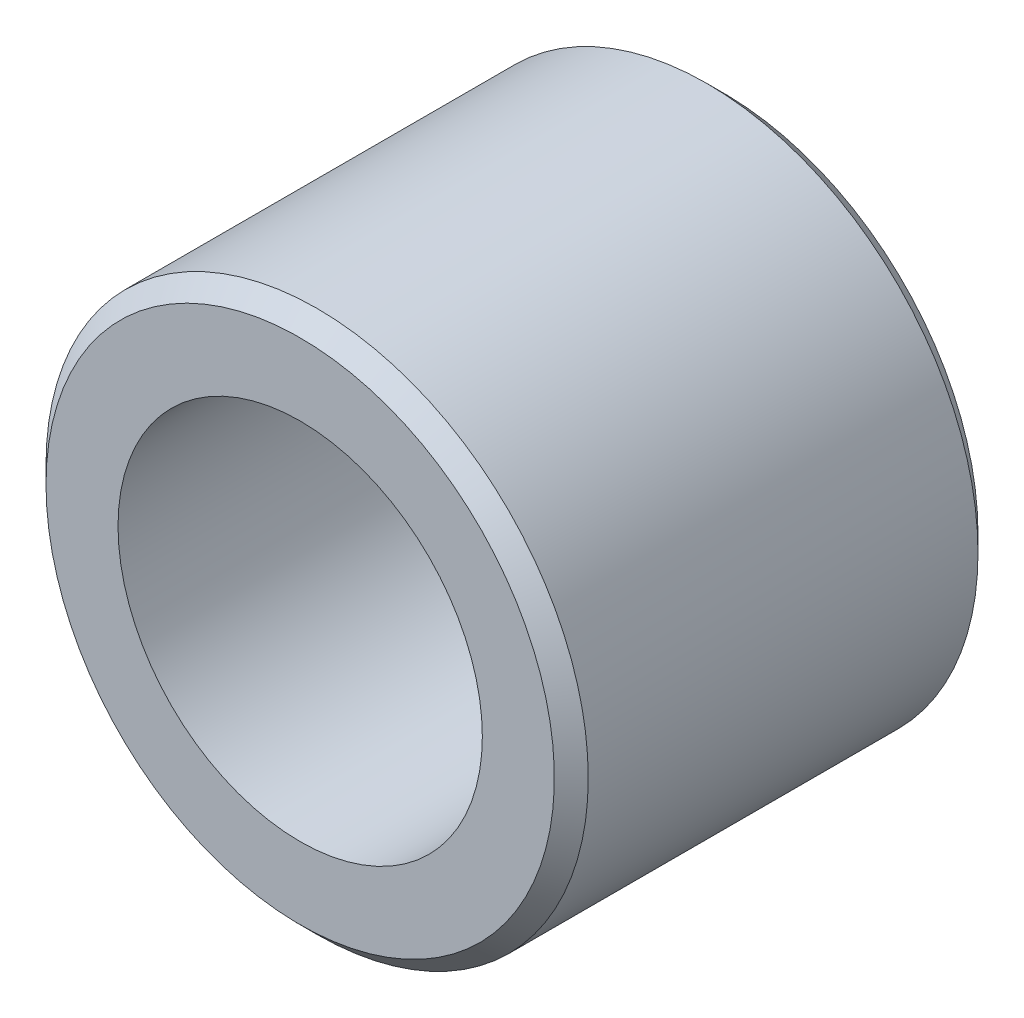
ISO-10303-21;
HEADER;
FILE_DESCRIPTION(('STEP AP214'),'2;1');
FILE_NAME('part.step','',(''),(''),'','','');
FILE_SCHEMA(('AUTOMOTIVE_DESIGN { 1 0 10303 214 1 1 1 1 }'));
ENDSEC;
DATA;
#1=APPLICATION_CONTEXT('core data for automotive mechanical design processes');
#2=APPLICATION_PROTOCOL_DEFINITION('international standard','automotive_design',2000,#1);
#3=PRODUCT_CONTEXT('',#1,'mechanical');
#4=PRODUCT('Part','Part','',(#3));
#5=PRODUCT_RELATED_PRODUCT_CATEGORY('part','',(#4));
#6=PRODUCT_DEFINITION_FORMATION('','',#4);
#7=PRODUCT_DEFINITION_CONTEXT('part definition',#1,'design');
#8=PRODUCT_DEFINITION('design','',#6,#7);
#9=PRODUCT_DEFINITION_SHAPE('','',#8);
#10=(LENGTH_UNIT() NAMED_UNIT(*) SI_UNIT(.MILLI.,.METRE.));
#11=(NAMED_UNIT(*) PLANE_ANGLE_UNIT() SI_UNIT($,.RADIAN.));
#12=(NAMED_UNIT(*) SI_UNIT($,.STERADIAN.) SOLID_ANGLE_UNIT());
#13=UNCERTAINTY_MEASURE_WITH_UNIT(LENGTH_MEASURE(1.E-05),#10,'distance_accuracy_value','');
#14=(GEOMETRIC_REPRESENTATION_CONTEXT(3) GLOBAL_UNCERTAINTY_ASSIGNED_CONTEXT((#13)) GLOBAL_UNIT_ASSIGNED_CONTEXT((#10,
#11,#12)) REPRESENTATION_CONTEXT('',''));
#15=CARTESIAN_POINT('',(0.,0.,0.));
#16=DIRECTION('',(0.,0.,1.));
#17=DIRECTION('',(1.,0.,0.));
#18=AXIS2_PLACEMENT_3D('',#15,#16,#17);
#19=CARTESIAN_POINT('',(0.,0.,10.));
#20=DIRECTION('',(0.,0.,1.));
#21=DIRECTION('',(1.,0.,0.));
#22=AXIS2_PLACEMENT_3D('',#19,#20,#21);
#23=PLANE('',#22);
#24=CARTESIAN_POINT('',(0.,0.,10.));
#25=DIRECTION('',(0.,0.,1.));
#26=DIRECTION('',(1.,0.,0.));
#27=AXIS2_PLACEMENT_3D('',#24,#25,#26);
#28=CIRCLE('',#27,6.00000000000001);
#29=CARTESIAN_POINT('',(-6.00000000000001,0.,10.));
#30=VERTEX_POINT('',#29);
#31=EDGE_CURVE('E45',#30,#30,#28,.T.);
#32=ORIENTED_EDGE('',*,*,#31,.T.);
#33=EDGE_LOOP('',(#32));
#34=FACE_BOUND('',#33,.T.);
#35=CARTESIAN_POINT('',(0.,0.,10.));
#36=DIRECTION('',(0.,0.,1.));
#37=DIRECTION('',(1.,0.,0.));
#38=AXIS2_PLACEMENT_3D('',#35,#36,#37);
#39=CIRCLE('',#38,4.3);
#40=CARTESIAN_POINT('',(4.3,0.,10.));
#41=VERTEX_POINT('',#40);
#42=EDGE_CURVE('E50',#41,#41,#39,.T.);
#43=ORIENTED_EDGE('',*,*,#42,.F.);
#44=EDGE_LOOP('',(#43));
#45=FACE_BOUND('',#44,.T.);
#46=ADVANCED_FACE('F30',(#34,#45),#23,.T.);
#47=CARTESIAN_POINT('',(0.,0.,0.));
#48=DIRECTION('',(0.,0.,1.));
#49=DIRECTION('',(1.,0.,0.));
#50=AXIS2_PLACEMENT_3D('',#47,#48,#49);
#51=PLANE('',#50);
#52=CARTESIAN_POINT('',(0.,0.,0.));
#53=DIRECTION('',(0.,0.,1.));
#54=DIRECTION('',(1.,0.,0.));
#55=AXIS2_PLACEMENT_3D('',#52,#53,#54);
#56=CIRCLE('',#55,6.);
#57=CARTESIAN_POINT('',(6.,0.,0.));
#58=VERTEX_POINT('',#57);
#59=EDGE_CURVE('E10',#58,#58,#56,.F.);
#60=ORIENTED_EDGE('',*,*,#59,.T.);
#61=EDGE_LOOP('',(#60));
#62=FACE_BOUND('',#61,.T.);
#63=CARTESIAN_POINT('',(0.,0.,0.));
#64=DIRECTION('',(0.,0.,1.));
#65=DIRECTION('',(1.,0.,0.));
#66=AXIS2_PLACEMENT_3D('',#63,#64,#65);
#67=CIRCLE('',#66,4.3);
#68=CARTESIAN_POINT('',(4.3,0.,0.));
#69=VERTEX_POINT('',#68);
#70=EDGE_CURVE('E51',#69,#69,#67,.T.);
#71=ORIENTED_EDGE('',*,*,#70,.T.);
#72=EDGE_LOOP('',(#71));
#73=FACE_BOUND('',#72,.T.);
#74=ADVANCED_FACE('F61',(#62,#73),#51,.F.);
#75=CARTESIAN_POINT('',(0.,0.,10.));
#76=DIRECTION('',(0.,0.,-1.));
#77=DIRECTION('',(-1.,0.,0.));
#78=AXIS2_PLACEMENT_3D('',#75,#76,#77);
#79=CYLINDRICAL_SURFACE('',#78,6.4);
#80=CARTESIAN_POINT('',(0.,0.,9.6));
#81=DIRECTION('',(0.,0.,1.));
#82=DIRECTION('',(1.,0.,0.));
#83=AXIS2_PLACEMENT_3D('',#80,#81,#82);
#84=CIRCLE('',#83,6.4);
#85=CARTESIAN_POINT('',(-6.4,0.,9.6));
#86=VERTEX_POINT('',#85);
#87=EDGE_CURVE('E37',#86,#86,#84,.F.);
#88=ORIENTED_EDGE('',*,*,#87,.T.);
#89=EDGE_LOOP('',(#88));
#90=FACE_BOUND('',#89,.T.);
#91=CARTESIAN_POINT('',(0.,0.,0.400000000000001));
#92=DIRECTION('',(0.,0.,1.));
#93=DIRECTION('',(1.,0.,0.));
#94=AXIS2_PLACEMENT_3D('',#91,#92,#93);
#95=CIRCLE('',#94,6.4);
#96=CARTESIAN_POINT('',(6.4,0.,0.400000000000001));
#97=VERTEX_POINT('',#96);
#98=EDGE_CURVE('E41',#97,#97,#95,.T.);
#99=ORIENTED_EDGE('',*,*,#98,.T.);
#100=EDGE_LOOP('',(#99));
#101=FACE_BOUND('',#100,.T.);
#102=ADVANCED_FACE('F67',(#90,#101),#79,.T.);
#103=CARTESIAN_POINT('',(0.,0.,10.));
#104=DIRECTION('',(0.,0.,-1.));
#105=DIRECTION('',(-1.,0.,0.));
#106=AXIS2_PLACEMENT_3D('',#103,#104,#105);
#107=CYLINDRICAL_SURFACE('',#106,4.3);
#108=ORIENTED_EDGE('',*,*,#42,.T.);
#109=EDGE_LOOP('',(#108));
#110=FACE_BOUND('',#109,.T.);
#111=ORIENTED_EDGE('',*,*,#70,.F.);
#112=EDGE_LOOP('',(#111));
#113=FACE_BOUND('',#112,.T.);
#114=ADVANCED_FACE('F57',(#110,#113),#107,.F.);
#115=CARTESIAN_POINT('',(0.,0.,10.));
#116=DIRECTION('',(0.,0.,-1.));
#117=DIRECTION('',(-1.,0.,0.));
#118=AXIS2_PLACEMENT_3D('',#115,#116,#117);
#119=CONICAL_SURFACE('',#118,6.00000000000001,0.785398163397441);
#120=CARTESIAN_POINT('',(-6.4,0.,9.6));
#121=CARTESIAN_POINT('',(-6.39583333333333,0.,9.60416666666667));
#122=CARTESIAN_POINT('',(-6.39166666666667,0.,9.60833333333333));
#123=CARTESIAN_POINT('',(-6.38333333333333,0.,9.61666666666667));
#124=CARTESIAN_POINT('',(-6.37916666666667,0.,9.62083333333333));
#125=CARTESIAN_POINT('',(-6.37083333333334,0.,9.62916666666667));
#126=CARTESIAN_POINT('',(-6.36666666666667,0.,9.63333333333333));
#127=CARTESIAN_POINT('',(-6.35833333333334,0.,9.64166666666667));
#128=CARTESIAN_POINT('',(-6.35416666666667,0.,9.64583333333333));
#129=CARTESIAN_POINT('',(-6.34583333333334,0.,9.65416666666667));
#130=CARTESIAN_POINT('',(-6.34166666666667,0.,9.65833333333333));
#131=CARTESIAN_POINT('',(-6.33333333333333,0.,9.66666666666667));
#132=CARTESIAN_POINT('',(-6.32916666666667,0.,9.67083333333333));
#133=CARTESIAN_POINT('',(-6.32083333333334,0.,9.67916666666667));
#134=CARTESIAN_POINT('',(-6.31666666666667,0.,9.68333333333333));
#135=CARTESIAN_POINT('',(-6.30833333333334,0.,9.69166666666667));
#136=CARTESIAN_POINT('',(-6.30416666666667,0.,9.69583333333333));
#137=CARTESIAN_POINT('',(-6.29583333333334,0.,9.70416666666667));
#138=CARTESIAN_POINT('',(-6.29166666666667,0.,9.70833333333333));
#139=CARTESIAN_POINT('',(-6.28333333333334,0.,9.71666666666667));
#140=CARTESIAN_POINT('',(-6.27916666666667,0.,9.72083333333333));
#141=CARTESIAN_POINT('',(-6.27083333333334,0.,9.72916666666667));
#142=CARTESIAN_POINT('',(-6.26666666666667,0.,9.73333333333333));
#143=CARTESIAN_POINT('',(-6.25833333333334,0.,9.74166666666667));
#144=CARTESIAN_POINT('',(-6.25416666666667,0.,9.74583333333333));
#145=CARTESIAN_POINT('',(-6.24583333333334,0.,9.75416666666667));
#146=CARTESIAN_POINT('',(-6.24166666666667,0.,9.75833333333333));
#147=CARTESIAN_POINT('',(-6.23333333333334,0.,9.76666666666667));
#148=CARTESIAN_POINT('',(-6.22916666666667,0.,9.77083333333333));
#149=CARTESIAN_POINT('',(-6.22083333333334,0.,9.77916666666667));
#150=CARTESIAN_POINT('',(-6.21666666666667,0.,9.78333333333333));
#151=CARTESIAN_POINT('',(-6.20833333333334,0.,9.79166666666667));
#152=CARTESIAN_POINT('',(-6.20416666666667,0.,9.79583333333333));
#153=CARTESIAN_POINT('',(-6.19583333333334,0.,9.80416666666667));
#154=CARTESIAN_POINT('',(-6.19166666666667,0.,9.80833333333333));
#155=CARTESIAN_POINT('',(-6.18333333333334,0.,9.81666666666667));
#156=CARTESIAN_POINT('',(-6.17916666666667,0.,9.82083333333333));
#157=CARTESIAN_POINT('',(-6.17083333333334,0.,9.82916666666667));
#158=CARTESIAN_POINT('',(-6.16666666666667,0.,9.83333333333333));
#159=CARTESIAN_POINT('',(-6.15833333333334,0.,9.84166666666667));
#160=CARTESIAN_POINT('',(-6.15416666666667,0.,9.84583333333333));
#161=CARTESIAN_POINT('',(-6.14583333333334,0.,9.85416666666667));
#162=CARTESIAN_POINT('',(-6.14166666666667,0.,9.85833333333333));
#163=CARTESIAN_POINT('',(-6.13333333333334,0.,9.86666666666667));
#164=CARTESIAN_POINT('',(-6.12916666666667,0.,9.87083333333333));
#165=CARTESIAN_POINT('',(-6.12083333333334,0.,9.87916666666667));
#166=CARTESIAN_POINT('',(-6.11666666666667,0.,9.88333333333333));
#167=CARTESIAN_POINT('',(-6.10833333333334,0.,9.89166666666667));
#168=CARTESIAN_POINT('',(-6.10416666666667,0.,9.89583333333333));
#169=CARTESIAN_POINT('',(-6.09583333333334,0.,9.90416666666667));
#170=CARTESIAN_POINT('',(-6.09166666666667,0.,9.90833333333333));
#171=CARTESIAN_POINT('',(-6.08333333333334,0.,9.91666666666667));
#172=CARTESIAN_POINT('',(-6.07916666666667,0.,9.92083333333333));
#173=CARTESIAN_POINT('',(-6.07083333333334,0.,9.92916666666667));
#174=CARTESIAN_POINT('',(-6.06666666666667,0.,9.93333333333333));
#175=CARTESIAN_POINT('',(-6.05833333333334,0.,9.94166666666667));
#176=CARTESIAN_POINT('',(-6.05416666666667,0.,9.94583333333333));
#177=CARTESIAN_POINT('',(-6.04583333333334,0.,9.95416666666667));
#178=CARTESIAN_POINT('',(-6.04166666666667,0.,9.95833333333333));
#179=CARTESIAN_POINT('',(-6.03333333333334,0.,9.96666666666667));
#180=CARTESIAN_POINT('',(-6.02916666666667,0.,9.97083333333333));
#181=CARTESIAN_POINT('',(-6.02083333333334,0.,9.97916666666667));
#182=CARTESIAN_POINT('',(-6.01666666666667,0.,9.98333333333333));
#183=CARTESIAN_POINT('',(-6.00833333333334,0.,9.99166666666667));
#184=CARTESIAN_POINT('',(-6.00416666666667,0.,9.99583333333333));
#185=CARTESIAN_POINT('',(-6.00000000000001,0.,10.));
#186=B_SPLINE_CURVE_WITH_KNOTS('',3,(#120,#121,#122,#123,#124,#125,#126,#127,#128,#129,#130,
#131,#132,#133,#134,#135,#136,#137,#138,#139,#140,#141,#142,#143,#144,#145,#146,#147,#148,#149,
#150,#151,#152,#153,#154,#155,#156,#157,#158,#159,#160,#161,#162,#163,#164,#165,#166,#167,#168,
#169,#170,#171,#172,#173,#174,#175,#176,#177,#178,#179,#180,#181,#182,#183,#184,#185),
.UNSPECIFIED.,.F.,.F.,(4,2,2,2,2,2,2,2,2,2,2,2,2,2,2,2,2,2,2,2,2,2,2,2,2,2,2,2,2,2,2,2,4),(0.,
0.0176776695296636,0.0353553390593278,0.0530330085889914,0.0707106781186549,0.0883883476483179,
0.106066017177981,0.123743686707645,0.141421356237309,0.159099025766973,0.176776695296635,
0.194454364826299,0.212132034355963,0.229809703885627,0.24748737341529,0.265165042944953,
0.282842712474617,0.300520382004281,0.318198051533945,0.335875721063607,0.353553390593271,
0.371231060122935,0.388908729652599,0.406586399182261,0.424264068711925,0.441941738241589,
0.459619407771253,0.477297077300916,0.494974746830579,0.512652416360243,0.530330085889906,
0.548007755419571,0.565685424949234),.UNSPECIFIED.);
#187=EDGE_CURVE('BSEAM72',#86,#30,#186,.T.);
#188=ORIENTED_EDGE('',*,*,#87,.F.);
#189=ORIENTED_EDGE('',*,*,#31,.F.);
#190=ORIENTED_EDGE('',*,*,#187,.T.);
#191=ORIENTED_EDGE('',*,*,#187,.F.);
#192=EDGE_LOOP('',(#188,#190,#189,#191));
#193=FACE_BOUND('',#192,.T.);
#194=ADVANCED_FACE('F72',(#193),#119,.T.);
#195=CARTESIAN_POINT('',(0.,0.,0.400000000000001));
#196=DIRECTION('',(0.,0.,1.));
#197=DIRECTION('',(1.,0.,0.));
#198=AXIS2_PLACEMENT_3D('',#195,#196,#197);
#199=CONICAL_SURFACE('',#198,6.4,0.785398163397449);
#200=ORIENTED_EDGE('',*,*,#59,.F.);
#201=EDGE_LOOP('',(#200));
#202=FACE_BOUND('',#201,.T.);
#203=ORIENTED_EDGE('',*,*,#98,.F.);
#204=EDGE_LOOP('',(#203));
#205=FACE_BOUND('',#204,.T.);
#206=ADVANCED_FACE('F32',(#202,#205),#199,.T.);
#207=CLOSED_SHELL('',(#46,#74,#102,#114,#194,#206));
#208=MANIFOLD_SOLID_BREP('B2',#207);
#209=ADVANCED_BREP_SHAPE_REPRESENTATION('',(#18,#208),#14);
#210=SHAPE_DEFINITION_REPRESENTATION(#9,#209);
ENDSEC;
END-ISO-10303-21;
